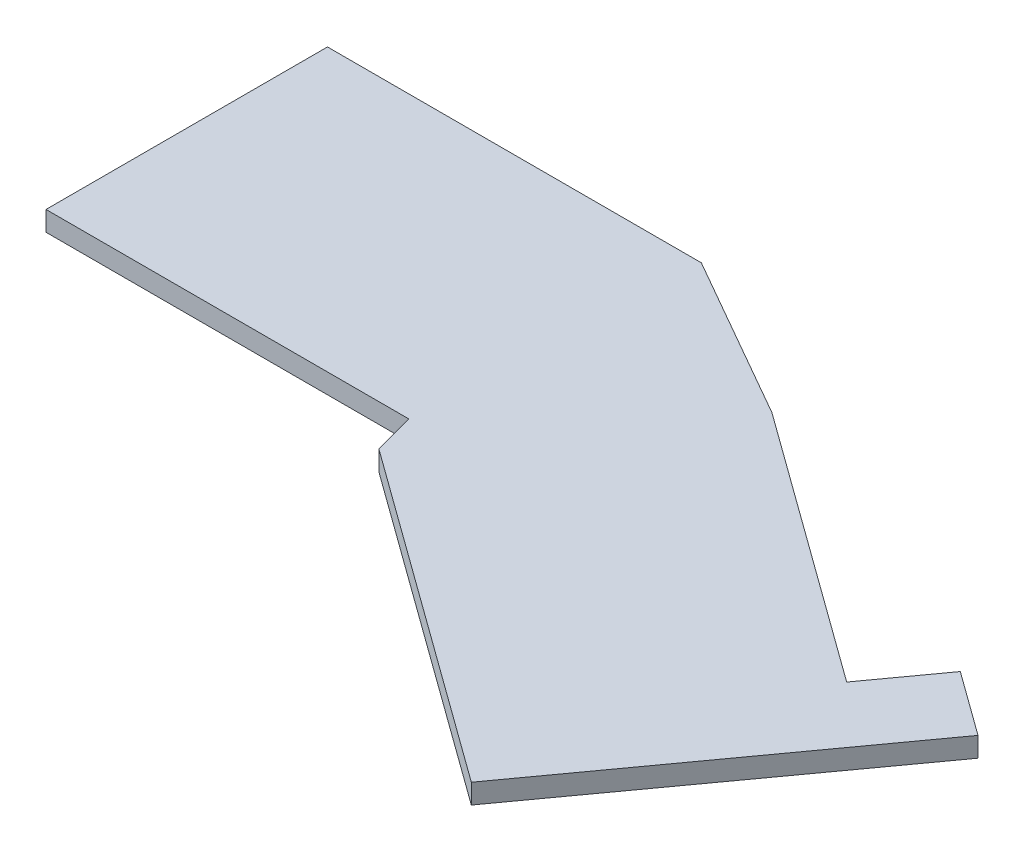
ISO-10303-21;
HEADER;
FILE_DESCRIPTION(('STEP AP214'),'2;1');
FILE_NAME('part.step','',(''),(''),'','','');
FILE_SCHEMA(('AUTOMOTIVE_DESIGN { 1 0 10303 214 1 1 1 1 }'));
ENDSEC;
DATA;
#1=APPLICATION_CONTEXT('core data for automotive mechanical design processes');
#2=APPLICATION_PROTOCOL_DEFINITION('international standard','automotive_design',2000,#1);
#3=PRODUCT_CONTEXT('',#1,'mechanical');
#4=PRODUCT('Part','Part','',(#3));
#5=PRODUCT_RELATED_PRODUCT_CATEGORY('part','',(#4));
#6=PRODUCT_DEFINITION_FORMATION('','',#4);
#7=PRODUCT_DEFINITION_CONTEXT('part definition',#1,'design');
#8=PRODUCT_DEFINITION('design','',#6,#7);
#9=PRODUCT_DEFINITION_SHAPE('','',#8);
#10=(LENGTH_UNIT() NAMED_UNIT(*) SI_UNIT(.MILLI.,.METRE.));
#11=(NAMED_UNIT(*) PLANE_ANGLE_UNIT() SI_UNIT($,.RADIAN.));
#12=(NAMED_UNIT(*) SI_UNIT($,.STERADIAN.) SOLID_ANGLE_UNIT());
#13=UNCERTAINTY_MEASURE_WITH_UNIT(LENGTH_MEASURE(1.E-05),#10,'distance_accuracy_value','');
#14=(GEOMETRIC_REPRESENTATION_CONTEXT(3) GLOBAL_UNCERTAINTY_ASSIGNED_CONTEXT((#13)) GLOBAL_UNIT_ASSIGNED_CONTEXT((#10,
#11,#12)) REPRESENTATION_CONTEXT('',''));
#15=CARTESIAN_POINT('',(0.,0.,0.));
#16=DIRECTION('',(0.,0.,1.));
#17=DIRECTION('',(1.,0.,0.));
#18=AXIS2_PLACEMENT_3D('',#15,#16,#17);
#19=CARTESIAN_POINT('',(83.75,-2.,-32.));
#20=DIRECTION('',(0.,0.,-1.));
#21=DIRECTION('',(-1.,0.,0.));
#22=AXIS2_PLACEMENT_3D('',#19,#20,#21);
#23=PLANE('',#22);
#24=DIRECTION('',(0.,1.,0.));
#25=VECTOR('',#24,1.);
#26=CARTESIAN_POINT('',(-1.25,-2.,-32.));
#27=LINE('',#26,#25);
#28=CARTESIAN_POINT('',(-1.25,-2.,-32.));
#29=VERTEX_POINT('',#28);
#30=CARTESIAN_POINT('',(-1.25,2.5,-32.));
#31=VERTEX_POINT('',#30);
#32=EDGE_CURVE('E42',#29,#31,#27,.T.);
#33=ORIENTED_EDGE('',*,*,#32,.T.);
#34=DIRECTION('',(-1.,0.,0.));
#35=VECTOR('',#34,1.);
#36=CARTESIAN_POINT('',(83.75,2.5,-32.));
#37=LINE('',#36,#35);
#38=CARTESIAN_POINT('',(83.75,2.5,-32.));
#39=VERTEX_POINT('',#38);
#40=EDGE_CURVE('E177',#39,#31,#37,.T.);
#41=ORIENTED_EDGE('',*,*,#40,.F.);
#42=DIRECTION('',(0.,1.,0.));
#43=VECTOR('',#42,1.);
#44=CARTESIAN_POINT('',(83.75,-2.,-32.));
#45=LINE('',#44,#43);
#46=CARTESIAN_POINT('',(83.75,-2.,-32.));
#47=VERTEX_POINT('',#46);
#48=EDGE_CURVE('E11',#47,#39,#45,.T.);
#49=ORIENTED_EDGE('',*,*,#48,.F.);
#50=DIRECTION('',(-1.,0.,0.));
#51=VECTOR('',#50,1.);
#52=CARTESIAN_POINT('',(83.75,-2.,-32.));
#53=LINE('',#52,#51);
#54=EDGE_CURVE('E178',#47,#29,#53,.T.);
#55=ORIENTED_EDGE('',*,*,#54,.T.);
#56=EDGE_LOOP('',(#33,#41,#49,#55));
#57=FACE_BOUND('',#56,.T.);
#58=ADVANCED_FACE('F39',(#57),#23,.T.);
#59=CARTESIAN_POINT('',(121.27783083109,-2.,-10.528824784684));
#60=DIRECTION('',(0.496604406106522,0.,-0.867976994992142));
#61=DIRECTION('',(-0.867976994992142,0.,-0.496604406106522));
#62=AXIS2_PLACEMENT_3D('',#59,#60,#61);
#63=PLANE('',#62);
#64=ORIENTED_EDGE('',*,*,#48,.T.);
#65=DIRECTION('',(-0.867976994992142,0.,-0.496604406106522));
#66=VECTOR('',#65,1.);
#67=CARTESIAN_POINT('',(121.27783083109,2.5,-10.5288247846841));
#68=LINE('',#67,#66);
#69=CARTESIAN_POINT('',(121.27783083109,2.5,-10.5288247846841));
#70=VERTEX_POINT('',#69);
#71=EDGE_CURVE('E198',#70,#39,#68,.T.);
#72=ORIENTED_EDGE('',*,*,#71,.F.);
#73=DIRECTION('',(0.,1.,0.));
#74=VECTOR('',#73,1.);
#75=CARTESIAN_POINT('',(121.27783083109,-2.,-10.528824784684));
#76=LINE('',#75,#74);
#77=CARTESIAN_POINT('',(121.27783083109,-2.,-10.528824784684));
#78=VERTEX_POINT('',#77);
#79=EDGE_CURVE('E48',#78,#70,#76,.T.);
#80=ORIENTED_EDGE('',*,*,#79,.F.);
#81=DIRECTION('',(-0.867976994992142,0.,-0.496604406106522));
#82=VECTOR('',#81,1.);
#83=CARTESIAN_POINT('',(121.27783083109,-2.,-10.528824784684));
#84=LINE('',#83,#82);
#85=EDGE_CURVE('E184',#78,#47,#84,.T.);
#86=ORIENTED_EDGE('',*,*,#85,.T.);
#87=EDGE_LOOP('',(#64,#72,#80,#86));
#88=FACE_BOUND('',#87,.T.);
#89=ADVANCED_FACE('F433',(#88),#63,.T.);
#90=CARTESIAN_POINT('',(182.840995504971,-2.,34.0354743272361));
#91=DIRECTION('',(0.586372356735791,0.,-0.810041640445795));
#92=DIRECTION('',(-0.810041640445795,0.,-0.586372356735791));
#93=AXIS2_PLACEMENT_3D('',#90,#91,#92);
#94=PLANE('',#93);
#95=ORIENTED_EDGE('',*,*,#79,.T.);
#96=DIRECTION('',(-0.810041640445795,0.,-0.586372356735791));
#97=VECTOR('',#96,1.);
#98=CARTESIAN_POINT('',(182.840995504971,2.5,34.0354743272362));
#99=LINE('',#98,#97);
#100=CARTESIAN_POINT('',(182.840995504971,2.5,34.0354743272362));
#101=VERTEX_POINT('',#100);
#102=EDGE_CURVE('E224',#101,#70,#99,.T.);
#103=ORIENTED_EDGE('',*,*,#102,.F.);
#104=DIRECTION('',(0.,1.,0.));
#105=VECTOR('',#104,1.);
#106=CARTESIAN_POINT('',(182.840995504971,-2.,34.0354743272361));
#107=LINE('',#106,#105);
#108=CARTESIAN_POINT('',(182.840995504971,-2.,34.0354743272361));
#109=VERTEX_POINT('',#108);
#110=EDGE_CURVE('E384',#109,#101,#107,.T.);
#111=ORIENTED_EDGE('',*,*,#110,.F.);
#112=DIRECTION('',(-0.810041640445795,0.,-0.586372356735791));
#113=VECTOR('',#112,1.);
#114=CARTESIAN_POINT('',(182.840995504971,-2.,34.0354743272361));
#115=LINE('',#114,#113);
#116=EDGE_CURVE('E375',#109,#78,#115,.T.);
#117=ORIENTED_EDGE('',*,*,#116,.T.);
#118=EDGE_LOOP('',(#95,#103,#111,#117));
#119=FACE_BOUND('',#118,.T.);
#120=ADVANCED_FACE('F430',(#119),#94,.T.);
#121=CARTESIAN_POINT('',(193.688884104583,-2.,19.0497039789889));
#122=DIRECTION('',(-0.810041640445795,0.,-0.586372356735791));
#123=DIRECTION('',(-0.586372356735791,0.,0.810041640445795));
#124=AXIS2_PLACEMENT_3D('',#121,#122,#123);
#125=PLANE('',#124);
#126=ORIENTED_EDGE('',*,*,#110,.T.);
#127=DIRECTION('',(-0.586372356735791,0.,0.810041640445795));
#128=VECTOR('',#127,1.);
#129=CARTESIAN_POINT('',(193.688884104583,2.5,19.0497039789889));
#130=LINE('',#129,#128);
#131=CARTESIAN_POINT('',(193.688884104583,2.5,19.0497039789889));
#132=VERTEX_POINT('',#131);
#133=EDGE_CURVE('E220',#132,#101,#130,.T.);
#134=ORIENTED_EDGE('',*,*,#133,.F.);
#135=DIRECTION('',(0.,1.,0.));
#136=VECTOR('',#135,1.);
#137=CARTESIAN_POINT('',(193.688884104583,-2.,19.0497039789889));
#138=LINE('',#137,#136);
#139=CARTESIAN_POINT('',(193.688884104583,-2.,19.0497039789889));
#140=VERTEX_POINT('',#139);
#141=EDGE_CURVE('E387',#140,#132,#138,.T.);
#142=ORIENTED_EDGE('',*,*,#141,.F.);
#143=DIRECTION('',(-0.586372356735791,0.,0.810041640445795));
#144=VECTOR('',#143,1.);
#145=CARTESIAN_POINT('',(193.688884104583,-2.,19.0497039789889));
#146=LINE('',#145,#144);
#147=EDGE_CURVE('E371',#140,#109,#146,.T.);
#148=ORIENTED_EDGE('',*,*,#147,.T.);
#149=EDGE_LOOP('',(#126,#134,#142,#148));
#150=FACE_BOUND('',#149,.T.);
#151=ADVANCED_FACE('F426',(#150),#125,.T.);
#152=CARTESIAN_POINT('',(208.269633632608,-2.,29.6044064002333));
#153=DIRECTION('',(0.58637235673579,0.,-0.810041640445795));
#154=DIRECTION('',(-0.810041640445795,0.,-0.58637235673579));
#155=AXIS2_PLACEMENT_3D('',#152,#153,#154);
#156=PLANE('',#155);
#157=ORIENTED_EDGE('',*,*,#141,.T.);
#158=DIRECTION('',(-0.810041640445795,0.,-0.586372356735791));
#159=VECTOR('',#158,1.);
#160=CARTESIAN_POINT('',(208.269633632608,2.5,29.6044064002333));
#161=LINE('',#160,#159);
#162=CARTESIAN_POINT('',(208.269633632608,2.5,29.6044064002333));
#163=VERTEX_POINT('',#162);
#164=EDGE_CURVE('E216',#163,#132,#161,.T.);
#165=ORIENTED_EDGE('',*,*,#164,.F.);
#166=DIRECTION('',(0.,1.,0.));
#167=VECTOR('',#166,1.);
#168=CARTESIAN_POINT('',(208.269633632608,-2.,29.6044064002333));
#169=LINE('',#168,#167);
#170=CARTESIAN_POINT('',(208.269633632608,-2.,29.6044064002333));
#171=VERTEX_POINT('',#170);
#172=EDGE_CURVE('E390',#171,#163,#169,.T.);
#173=ORIENTED_EDGE('',*,*,#172,.F.);
#174=DIRECTION('',(-0.810041640445795,0.,-0.58637235673579));
#175=VECTOR('',#174,1.);
#176=CARTESIAN_POINT('',(208.269633632608,-2.,29.6044064002333));
#177=LINE('',#176,#175);
#178=EDGE_CURVE('E367',#171,#140,#177,.T.);
#179=ORIENTED_EDGE('',*,*,#178,.T.);
#180=EDGE_LOOP('',(#157,#165,#173,#179));
#181=FACE_BOUND('',#180,.T.);
#182=ADVANCED_FACE('F424',(#181),#156,.T.);
#183=CARTESIAN_POINT('',(159.893914201905,-2.,96.4328417370113));
#184=DIRECTION('',(0.810041640445794,0.,0.586372356735792));
#185=DIRECTION('',(0.586372356735792,0.,-0.810041640445794));
#186=AXIS2_PLACEMENT_3D('',#183,#184,#185);
#187=PLANE('',#186);
#188=ORIENTED_EDGE('',*,*,#172,.T.);
#189=DIRECTION('',(0.586372356735791,0.,-0.810041640445794));
#190=VECTOR('',#189,1.);
#191=CARTESIAN_POINT('',(159.893914201905,2.5,96.4328417370113));
#192=LINE('',#191,#190);
#193=CARTESIAN_POINT('',(159.893914201905,2.5,96.4328417370113));
#194=VERTEX_POINT('',#193);
#195=EDGE_CURVE('E212',#194,#163,#192,.T.);
#196=ORIENTED_EDGE('',*,*,#195,.F.);
#197=DIRECTION('',(0.,1.,0.));
#198=VECTOR('',#197,1.);
#199=CARTESIAN_POINT('',(159.893914201905,-2.,96.4328417370113));
#200=LINE('',#199,#198);
#201=CARTESIAN_POINT('',(159.893914201905,-2.,96.4328417370113));
#202=VERTEX_POINT('',#201);
#203=EDGE_CURVE('E393',#202,#194,#200,.T.);
#204=ORIENTED_EDGE('',*,*,#203,.F.);
#205=DIRECTION('',(0.586372356735792,0.,-0.810041640445794));
#206=VECTOR('',#205,1.);
#207=CARTESIAN_POINT('',(159.893914201905,-2.,96.4328417370113));
#208=LINE('',#207,#206);
#209=EDGE_CURVE('E363',#202,#171,#208,.T.);
#210=ORIENTED_EDGE('',*,*,#209,.T.);
#211=EDGE_LOOP('',(#188,#196,#204,#210));
#212=FACE_BOUND('',#211,.T.);
#213=ADVANCED_FACE('F419',(#212),#187,.T.);
#214=CARTESIAN_POINT('',(83.75,-2.,41.3138402038469));
#215=DIRECTION('',(-0.586372356735791,0.,0.810041640445795));
#216=DIRECTION('',(0.810041640445795,0.,0.586372356735791));
#217=AXIS2_PLACEMENT_3D('',#214,#215,#216);
#218=PLANE('',#217);
#219=ORIENTED_EDGE('',*,*,#203,.T.);
#220=DIRECTION('',(0.810041640445795,0.,0.586372356735791));
#221=VECTOR('',#220,1.);
#222=CARTESIAN_POINT('',(83.75,2.5,41.3138402038469));
#223=LINE('',#222,#221);
#224=CARTESIAN_POINT('',(83.75,2.5,41.3138402038469));
#225=VERTEX_POINT('',#224);
#226=EDGE_CURVE('E208',#225,#194,#223,.T.);
#227=ORIENTED_EDGE('',*,*,#226,.F.);
#228=DIRECTION('',(0.,1.,0.));
#229=VECTOR('',#228,1.);
#230=CARTESIAN_POINT('',(83.75,-2.,41.3138402038469));
#231=LINE('',#230,#229);
#232=CARTESIAN_POINT('',(83.75,-2.,41.3138402038469));
#233=VERTEX_POINT('',#232);
#234=EDGE_CURVE('E396',#233,#225,#231,.T.);
#235=ORIENTED_EDGE('',*,*,#234,.F.);
#236=DIRECTION('',(0.810041640445795,0.,0.586372356735791));
#237=VECTOR('',#236,1.);
#238=CARTESIAN_POINT('',(83.75,-2.,41.3138402038469));
#239=LINE('',#238,#237);
#240=EDGE_CURVE('E359',#233,#202,#239,.T.);
#241=ORIENTED_EDGE('',*,*,#240,.T.);
#242=EDGE_LOOP('',(#219,#227,#235,#241));
#243=FACE_BOUND('',#242,.T.);
#244=ADVANCED_FACE('F412',(#243),#218,.T.);
#245=CARTESIAN_POINT('',(81.25,-2.,32.));
#246=DIRECTION('',(-0.965812600121666,0.,0.259241241792712));
#247=DIRECTION('',(0.259241241792712,0.,0.965812600121666));
#248=AXIS2_PLACEMENT_3D('',#245,#246,#247);
#249=PLANE('',#248);
#250=ORIENTED_EDGE('',*,*,#234,.T.);
#251=DIRECTION('',(0.259241241792712,0.,0.965812600121666));
#252=VECTOR('',#251,1.);
#253=CARTESIAN_POINT('',(81.25,2.5,32.));
#254=LINE('',#253,#252);
#255=CARTESIAN_POINT('',(81.25,2.5,32.));
#256=VERTEX_POINT('',#255);
#257=EDGE_CURVE('E204',#256,#225,#254,.T.);
#258=ORIENTED_EDGE('',*,*,#257,.F.);
#259=DIRECTION('',(0.,1.,0.));
#260=VECTOR('',#259,1.);
#261=CARTESIAN_POINT('',(81.25,-2.,32.));
#262=LINE('',#261,#260);
#263=CARTESIAN_POINT('',(81.25,-2.,32.));
#264=VERTEX_POINT('',#263);
#265=EDGE_CURVE('E399',#264,#256,#262,.T.);
#266=ORIENTED_EDGE('',*,*,#265,.F.);
#267=DIRECTION('',(0.259241241792712,0.,0.965812600121666));
#268=VECTOR('',#267,1.);
#269=CARTESIAN_POINT('',(81.25,-2.,32.));
#270=LINE('',#269,#268);
#271=EDGE_CURVE('E355',#264,#233,#270,.T.);
#272=ORIENTED_EDGE('',*,*,#271,.T.);
#273=EDGE_LOOP('',(#250,#258,#266,#272));
#274=FACE_BOUND('',#273,.T.);
#275=ADVANCED_FACE('F409',(#274),#249,.T.);
#276=CARTESIAN_POINT('',(-1.25,-2.,32.));
#277=DIRECTION('',(0.,0.,1.));
#278=DIRECTION('',(1.,0.,0.));
#279=AXIS2_PLACEMENT_3D('',#276,#277,#278);
#280=PLANE('',#279);
#281=ORIENTED_EDGE('',*,*,#265,.T.);
#282=DIRECTION('',(1.,0.,0.));
#283=VECTOR('',#282,1.);
#284=CARTESIAN_POINT('',(-1.25,2.5,32.));
#285=LINE('',#284,#283);
#286=CARTESIAN_POINT('',(-1.25,2.5,32.));
#287=VERTEX_POINT('',#286);
#288=EDGE_CURVE('E192',#287,#256,#285,.T.);
#289=ORIENTED_EDGE('',*,*,#288,.F.);
#290=DIRECTION('',(0.,1.,0.));
#291=VECTOR('',#290,1.);
#292=CARTESIAN_POINT('',(-1.25,-2.,32.));
#293=LINE('',#292,#291);
#294=CARTESIAN_POINT('',(-1.25,-2.,32.));
#295=VERTEX_POINT('',#294);
#296=EDGE_CURVE('E183',#295,#287,#293,.T.);
#297=ORIENTED_EDGE('',*,*,#296,.F.);
#298=DIRECTION('',(1.,0.,0.));
#299=VECTOR('',#298,1.);
#300=CARTESIAN_POINT('',(-1.25,-2.,32.));
#301=LINE('',#300,#299);
#302=EDGE_CURVE('E351',#295,#264,#301,.T.);
#303=ORIENTED_EDGE('',*,*,#302,.T.);
#304=EDGE_LOOP('',(#281,#289,#297,#303));
#305=FACE_BOUND('',#304,.T.);
#306=ADVANCED_FACE('F403',(#305),#280,.T.);
#307=CARTESIAN_POINT('',(-1.25,-2.,-32.));
#308=DIRECTION('',(-1.,0.,0.));
#309=DIRECTION('',(0.,0.,1.));
#310=AXIS2_PLACEMENT_3D('',#307,#308,#309);
#311=PLANE('',#310);
#312=ORIENTED_EDGE('',*,*,#296,.T.);
#313=DIRECTION('',(0.,0.,1.));
#314=VECTOR('',#313,1.);
#315=CARTESIAN_POINT('',(-1.25,2.5,-32.));
#316=LINE('',#315,#314);
#317=EDGE_CURVE('E186',#31,#287,#316,.T.);
#318=ORIENTED_EDGE('',*,*,#317,.F.);
#319=ORIENTED_EDGE('',*,*,#32,.F.);
#320=DIRECTION('',(0.,0.,1.));
#321=VECTOR('',#320,1.);
#322=CARTESIAN_POINT('',(-1.25,-2.,-32.));
#323=LINE('',#322,#321);
#324=EDGE_CURVE('E348',#29,#295,#323,.T.);
#325=ORIENTED_EDGE('',*,*,#324,.T.);
#326=EDGE_LOOP('',(#312,#318,#319,#325));
#327=FACE_BOUND('',#326,.T.);
#328=ADVANCED_FACE('F187',(#327),#311,.T.);
#329=CARTESIAN_POINT('',(0.,-2.,0.));
#330=DIRECTION('',(0.,1.,0.));
#331=DIRECTION('',(0.,0.,1.));
#332=AXIS2_PLACEMENT_3D('',#329,#330,#331);
#333=PLANE('',#332);
#334=DIRECTION('',(-0.867976994992141,0.,-0.496604406106522));
#335=VECTOR('',#334,1.);
#336=CARTESIAN_POINT('',(120.59903327137,-2.,-9.47706172384793));
#337=LINE('',#336,#335);
#338=CARTESIAN_POINT('',(120.59903327137,-2.,-9.47706172384793));
#339=VERTEX_POINT('',#338);
#340=CARTESIAN_POINT('',(83.4176856785189,-2.,-30.75));
#341=VERTEX_POINT('',#340);
#342=EDGE_CURVE('E265',#339,#341,#337,.T.);
#343=ORIENTED_EDGE('',*,*,#342,.T.);
#344=DIRECTION('',(-1.,0.,0.));
#345=VECTOR('',#344,1.);
#346=CARTESIAN_POINT('',(83.4176856785189,-2.,-30.75));
#347=LINE('',#346,#345);
#348=CARTESIAN_POINT('',(0.,-2.,-30.75));
#349=VERTEX_POINT('',#348);
#350=EDGE_CURVE('E230',#341,#349,#347,.T.);
#351=ORIENTED_EDGE('',*,*,#350,.T.);
#352=DIRECTION('',(0.,0.,1.));
#353=VECTOR('',#352,1.);
#354=CARTESIAN_POINT('',(0.,-2.,-30.75));
#355=LINE('',#354,#353);
#356=CARTESIAN_POINT('',(0.,-2.,30.75));
#357=VERTEX_POINT('',#356);
#358=EDGE_CURVE('E234',#349,#357,#355,.T.);
#359=ORIENTED_EDGE('',*,*,#358,.T.);
#360=DIRECTION('',(1.,0.,0.));
#361=VECTOR('',#360,1.);
#362=CARTESIAN_POINT('',(0.,-2.,30.75));
#363=LINE('',#362,#361);
#364=CARTESIAN_POINT('',(82.2087247543079,-2.,30.75));
#365=VERTEX_POINT('',#364);
#366=EDGE_CURVE('E56',#357,#365,#363,.T.);
#367=ORIENTED_EDGE('',*,*,#366,.T.);
#368=DIRECTION('',(0.259241241792712,0.,0.965812600121666));
#369=VECTOR('',#368,1.);
#370=CARTESIAN_POINT('',(82.2087247543079,-2.,30.75));
#371=LINE('',#370,#369);
#372=CARTESIAN_POINT('',(84.8422744771276,-2.,40.5613845148914));
#373=VERTEX_POINT('',#372);
#374=EDGE_CURVE('E241',#365,#373,#371,.T.);
#375=ORIENTED_EDGE('',*,*,#374,.T.);
#376=DIRECTION('',(0.810041640445795,0.,0.586372356735791));
#377=VECTOR('',#376,1.);
#378=CARTESIAN_POINT('',(84.8422744771276,-2.,40.5613845148914));
#379=LINE('',#378,#377);
#380=CARTESIAN_POINT('',(159.614327597267,-2.,94.6873242405344));
#381=VERTEX_POINT('',#380);
#382=EDGE_CURVE('E245',#373,#381,#379,.T.);
#383=ORIENTED_EDGE('',*,*,#382,.T.);
#384=DIRECTION('',(0.586372356735791,0.,-0.810041640445794));
#385=VECTOR('',#384,1.);
#386=CARTESIAN_POINT('',(159.614327597267,-2.,94.6873242405344));
#387=LINE('',#386,#385);
#388=CARTESIAN_POINT('',(206.524116136131,-2.,29.8839930048708));
#389=VERTEX_POINT('',#388);
#390=EDGE_CURVE('E249',#381,#389,#387,.T.);
#391=ORIENTED_EDGE('',*,*,#390,.T.);
#392=DIRECTION('',(-0.810041640445795,0.,-0.58637235673579));
#393=VECTOR('',#392,1.);
#394=CARTESIAN_POINT('',(206.524116136131,-2.,29.8839930048708));
#395=LINE('',#394,#393);
#396=CARTESIAN_POINT('',(193.968470709221,-2.,20.7952214754659));
#397=VERTEX_POINT('',#396);
#398=EDGE_CURVE('E253',#389,#397,#395,.T.);
#399=ORIENTED_EDGE('',*,*,#398,.T.);
#400=DIRECTION('',(-0.586372356735791,0.,0.810041640445795));
#401=VECTOR('',#400,1.);
#402=CARTESIAN_POINT('',(193.968470709221,-2.,20.7952214754659));
#403=LINE('',#402,#401);
#404=CARTESIAN_POINT('',(183.120582109609,-2.,35.7809918237131));
#405=VERTEX_POINT('',#404);
#406=EDGE_CURVE('E257',#397,#405,#403,.T.);
#407=ORIENTED_EDGE('',*,*,#406,.T.);
#408=DIRECTION('',(-0.810041640445795,0.,-0.586372356735791));
#409=VECTOR('',#408,1.);
#410=CARTESIAN_POINT('',(183.120582109609,-2.,35.7809918237131));
#411=LINE('',#410,#409);
#412=EDGE_CURVE('E261',#405,#339,#411,.T.);
#413=ORIENTED_EDGE('',*,*,#412,.T.);
#414=EDGE_LOOP('',(#343,#351,#359,#367,#375,#383,#391,#399,#407,#413));
#415=FACE_BOUND('',#414,.T.);
#416=ORIENTED_EDGE('',*,*,#54,.F.);
#417=ORIENTED_EDGE('',*,*,#85,.F.);
#418=ORIENTED_EDGE('',*,*,#116,.F.);
#419=ORIENTED_EDGE('',*,*,#147,.F.);
#420=ORIENTED_EDGE('',*,*,#178,.F.);
#421=ORIENTED_EDGE('',*,*,#209,.F.);
#422=ORIENTED_EDGE('',*,*,#240,.F.);
#423=ORIENTED_EDGE('',*,*,#271,.F.);
#424=ORIENTED_EDGE('',*,*,#302,.F.);
#425=ORIENTED_EDGE('',*,*,#324,.F.);
#426=EDGE_LOOP('',(#416,#417,#418,#419,#420,#421,#422,#423,#424,#425));
#427=FACE_BOUND('',#426,.T.);
#428=ADVANCED_FACE('F415',(#415,#427),#333,.F.);
#429=CARTESIAN_POINT('',(83.4176856785189,-2.,-30.75));
#430=DIRECTION('',(0.,0.,-1.));
#431=DIRECTION('',(-1.,0.,0.));
#432=AXIS2_PLACEMENT_3D('',#429,#430,#431);
#433=PLANE('',#432);
#434=DIRECTION('',(-1.,0.,0.));
#435=VECTOR('',#434,1.);
#436=CARTESIAN_POINT('',(83.4176856785189,0.,-30.75));
#437=LINE('',#436,#435);
#438=CARTESIAN_POINT('',(83.4176856785189,0.,-30.75));
#439=VERTEX_POINT('',#438);
#440=CARTESIAN_POINT('',(0.,0.,-30.75));
#441=VERTEX_POINT('',#440);
#442=EDGE_CURVE('E229',#439,#441,#437,.T.);
#443=ORIENTED_EDGE('',*,*,#442,.T.);
#444=DIRECTION('',(0.,1.,0.));
#445=VECTOR('',#444,1.);
#446=CARTESIAN_POINT('',(0.,-2.,-30.75));
#447=LINE('',#446,#445);
#448=EDGE_CURVE('E269',#349,#441,#447,.T.);
#449=ORIENTED_EDGE('',*,*,#448,.F.);
#450=ORIENTED_EDGE('',*,*,#350,.F.);
#451=DIRECTION('',(0.,1.,0.));
#452=VECTOR('',#451,1.);
#453=CARTESIAN_POINT('',(83.4176856785189,-2.,-30.75));
#454=LINE('',#453,#452);
#455=EDGE_CURVE('E308',#341,#439,#454,.T.);
#456=ORIENTED_EDGE('',*,*,#455,.T.);
#457=EDGE_LOOP('',(#443,#449,#450,#456));
#458=FACE_BOUND('',#457,.T.);
#459=ADVANCED_FACE('F459',(#458),#433,.F.);
#460=CARTESIAN_POINT('',(120.59903327137,-2.,-9.47706172384793));
#461=DIRECTION('',(0.496604406106522,0.,-0.867976994992142));
#462=DIRECTION('',(-0.867976994992142,0.,-0.496604406106522));
#463=AXIS2_PLACEMENT_3D('',#460,#461,#462);
#464=PLANE('',#463);
#465=DIRECTION('',(-0.867976994992141,0.,-0.496604406106522));
#466=VECTOR('',#465,1.);
#467=CARTESIAN_POINT('',(120.59903327137,0.,-9.47706172384793));
#468=LINE('',#467,#466);
#469=CARTESIAN_POINT('',(120.59903327137,0.,-9.47706172384793));
#470=VERTEX_POINT('',#469);
#471=EDGE_CURVE('E235',#470,#439,#468,.T.);
#472=ORIENTED_EDGE('',*,*,#471,.T.);
#473=ORIENTED_EDGE('',*,*,#455,.F.);
#474=ORIENTED_EDGE('',*,*,#342,.F.);
#475=DIRECTION('',(0.,1.,0.));
#476=VECTOR('',#475,1.);
#477=CARTESIAN_POINT('',(120.59903327137,-2.,-9.47706172384793));
#478=LINE('',#477,#476);
#479=EDGE_CURVE('E312',#339,#470,#478,.T.);
#480=ORIENTED_EDGE('',*,*,#479,.T.);
#481=EDGE_LOOP('',(#472,#473,#474,#480));
#482=FACE_BOUND('',#481,.T.);
#483=ADVANCED_FACE('F464',(#482),#464,.F.);
#484=CARTESIAN_POINT('',(183.120582109609,-2.,35.7809918237131));
#485=DIRECTION('',(0.586372356735791,0.,-0.810041640445795));
#486=DIRECTION('',(-0.810041640445795,0.,-0.586372356735791));
#487=AXIS2_PLACEMENT_3D('',#484,#485,#486);
#488=PLANE('',#487);
#489=DIRECTION('',(-0.810041640445795,0.,-0.586372356735791));
#490=VECTOR('',#489,1.);
#491=CARTESIAN_POINT('',(183.120582109609,0.,35.7809918237131));
#492=LINE('',#491,#490);
#493=CARTESIAN_POINT('',(183.120582109609,0.,35.7809918237131));
#494=VERTEX_POINT('',#493);
#495=EDGE_CURVE('E301',#494,#470,#492,.T.);
#496=ORIENTED_EDGE('',*,*,#495,.T.);
#497=ORIENTED_EDGE('',*,*,#479,.F.);
#498=ORIENTED_EDGE('',*,*,#412,.F.);
#499=DIRECTION('',(0.,1.,0.));
#500=VECTOR('',#499,1.);
#501=CARTESIAN_POINT('',(183.120582109609,-2.,35.7809918237131));
#502=LINE('',#501,#500);
#503=EDGE_CURVE('E316',#405,#494,#502,.T.);
#504=ORIENTED_EDGE('',*,*,#503,.T.);
#505=EDGE_LOOP('',(#496,#497,#498,#504));
#506=FACE_BOUND('',#505,.T.);
#507=ADVANCED_FACE('F489',(#506),#488,.F.);
#508=CARTESIAN_POINT('',(193.968470709221,-2.,20.7952214754659));
#509=DIRECTION('',(-0.810041640445795,0.,-0.586372356735791));
#510=DIRECTION('',(-0.586372356735791,0.,0.810041640445795));
#511=AXIS2_PLACEMENT_3D('',#508,#509,#510);
#512=PLANE('',#511);
#513=DIRECTION('',(-0.586372356735791,0.,0.810041640445795));
#514=VECTOR('',#513,1.);
#515=CARTESIAN_POINT('',(193.968470709221,0.,20.7952214754659));
#516=LINE('',#515,#514);
#517=CARTESIAN_POINT('',(193.968470709221,0.,20.7952214754659));
#518=VERTEX_POINT('',#517);
#519=EDGE_CURVE('E297',#518,#494,#516,.T.);
#520=ORIENTED_EDGE('',*,*,#519,.T.);
#521=ORIENTED_EDGE('',*,*,#503,.F.);
#522=ORIENTED_EDGE('',*,*,#406,.F.);
#523=DIRECTION('',(0.,1.,0.));
#524=VECTOR('',#523,1.);
#525=CARTESIAN_POINT('',(193.968470709221,-2.,20.7952214754659));
#526=LINE('',#525,#524);
#527=EDGE_CURVE('E320',#397,#518,#526,.T.);
#528=ORIENTED_EDGE('',*,*,#527,.T.);
#529=EDGE_LOOP('',(#520,#521,#522,#528));
#530=FACE_BOUND('',#529,.T.);
#531=ADVANCED_FACE('F487',(#530),#512,.F.);
#532=CARTESIAN_POINT('',(206.524116136131,-2.,29.8839930048708));
#533=DIRECTION('',(0.58637235673579,0.,-0.810041640445795));
#534=DIRECTION('',(-0.810041640445795,0.,-0.586372356735791));
#535=AXIS2_PLACEMENT_3D('',#532,#533,#534);
#536=PLANE('',#535);
#537=DIRECTION('',(-0.810041640445795,0.,-0.58637235673579));
#538=VECTOR('',#537,1.);
#539=CARTESIAN_POINT('',(206.524116136131,0.,29.8839930048708));
#540=LINE('',#539,#538);
#541=CARTESIAN_POINT('',(206.524116136131,0.,29.8839930048708));
#542=VERTEX_POINT('',#541);
#543=EDGE_CURVE('E293',#542,#518,#540,.T.);
#544=ORIENTED_EDGE('',*,*,#543,.T.);
#545=ORIENTED_EDGE('',*,*,#527,.F.);
#546=ORIENTED_EDGE('',*,*,#398,.F.);
#547=DIRECTION('',(0.,1.,0.));
#548=VECTOR('',#547,1.);
#549=CARTESIAN_POINT('',(206.524116136131,-2.,29.8839930048708));
#550=LINE('',#549,#548);
#551=EDGE_CURVE('E324',#389,#542,#550,.T.);
#552=ORIENTED_EDGE('',*,*,#551,.T.);
#553=EDGE_LOOP('',(#544,#545,#546,#552));
#554=FACE_BOUND('',#553,.T.);
#555=ADVANCED_FACE('F485',(#554),#536,.F.);
#556=CARTESIAN_POINT('',(159.614327597267,-2.,94.6873242405344));
#557=DIRECTION('',(0.810041640445795,0.,0.586372356735792));
#558=DIRECTION('',(0.586372356735792,0.,-0.810041640445795));
#559=AXIS2_PLACEMENT_3D('',#556,#557,#558);
#560=PLANE('',#559);
#561=DIRECTION('',(0.586372356735791,0.,-0.810041640445794));
#562=VECTOR('',#561,1.);
#563=CARTESIAN_POINT('',(159.614327597267,0.,94.6873242405344));
#564=LINE('',#563,#562);
#565=CARTESIAN_POINT('',(159.614327597267,0.,94.6873242405344));
#566=VERTEX_POINT('',#565);
#567=EDGE_CURVE('E289',#566,#542,#564,.T.);
#568=ORIENTED_EDGE('',*,*,#567,.T.);
#569=ORIENTED_EDGE('',*,*,#551,.F.);
#570=ORIENTED_EDGE('',*,*,#390,.F.);
#571=DIRECTION('',(0.,1.,0.));
#572=VECTOR('',#571,1.);
#573=CARTESIAN_POINT('',(159.614327597267,-2.,94.6873242405344));
#574=LINE('',#573,#572);
#575=EDGE_CURVE('E328',#381,#566,#574,.T.);
#576=ORIENTED_EDGE('',*,*,#575,.T.);
#577=EDGE_LOOP('',(#568,#569,#570,#576));
#578=FACE_BOUND('',#577,.T.);
#579=ADVANCED_FACE('F481',(#578),#560,.F.);
#580=CARTESIAN_POINT('',(84.8422744771276,-2.,40.5613845148914));
#581=DIRECTION('',(-0.586372356735791,0.,0.810041640445795));
#582=DIRECTION('',(0.810041640445795,0.,0.586372356735791));
#583=AXIS2_PLACEMENT_3D('',#580,#581,#582);
#584=PLANE('',#583);
#585=DIRECTION('',(0.810041640445795,0.,0.586372356735791));
#586=VECTOR('',#585,1.);
#587=CARTESIAN_POINT('',(84.8422744771276,0.,40.5613845148914));
#588=LINE('',#587,#586);
#589=CARTESIAN_POINT('',(84.8422744771276,0.,40.5613845148914));
#590=VERTEX_POINT('',#589);
#591=EDGE_CURVE('E285',#590,#566,#588,.T.);
#592=ORIENTED_EDGE('',*,*,#591,.T.);
#593=ORIENTED_EDGE('',*,*,#575,.F.);
#594=ORIENTED_EDGE('',*,*,#382,.F.);
#595=DIRECTION('',(0.,1.,0.));
#596=VECTOR('',#595,1.);
#597=CARTESIAN_POINT('',(84.8422744771276,-2.,40.5613845148914));
#598=LINE('',#597,#596);
#599=EDGE_CURVE('E332',#373,#590,#598,.T.);
#600=ORIENTED_EDGE('',*,*,#599,.T.);
#601=EDGE_LOOP('',(#592,#593,#594,#600));
#602=FACE_BOUND('',#601,.T.);
#603=ADVANCED_FACE('F478',(#602),#584,.F.);
#604=CARTESIAN_POINT('',(82.2087247543079,-2.,30.75));
#605=DIRECTION('',(-0.965812600121666,0.,0.259241241792712));
#606=DIRECTION('',(0.259241241792712,0.,0.965812600121666));
#607=AXIS2_PLACEMENT_3D('',#604,#605,#606);
#608=PLANE('',#607);
#609=DIRECTION('',(0.259241241792712,0.,0.965812600121666));
#610=VECTOR('',#609,1.);
#611=CARTESIAN_POINT('',(82.2087247543079,0.,30.75));
#612=LINE('',#611,#610);
#613=CARTESIAN_POINT('',(82.2087247543079,0.,30.75));
#614=VERTEX_POINT('',#613);
#615=EDGE_CURVE('E281',#614,#590,#612,.T.);
#616=ORIENTED_EDGE('',*,*,#615,.T.);
#617=ORIENTED_EDGE('',*,*,#599,.F.);
#618=ORIENTED_EDGE('',*,*,#374,.F.);
#619=DIRECTION('',(0.,1.,0.));
#620=VECTOR('',#619,1.);
#621=CARTESIAN_POINT('',(82.2087247543079,-2.,30.75));
#622=LINE('',#621,#620);
#623=EDGE_CURVE('E336',#365,#614,#622,.T.);
#624=ORIENTED_EDGE('',*,*,#623,.T.);
#625=EDGE_LOOP('',(#616,#617,#618,#624));
#626=FACE_BOUND('',#625,.T.);
#627=ADVANCED_FACE('F476',(#626),#608,.F.);
#628=CARTESIAN_POINT('',(0.,-2.,30.75));
#629=DIRECTION('',(0.,0.,1.));
#630=DIRECTION('',(1.,0.,0.));
#631=AXIS2_PLACEMENT_3D('',#628,#629,#630);
#632=PLANE('',#631);
#633=DIRECTION('',(1.,0.,0.));
#634=VECTOR('',#633,1.);
#635=CARTESIAN_POINT('',(0.,0.,30.75));
#636=LINE('',#635,#634);
#637=CARTESIAN_POINT('',(0.,0.,30.75));
#638=VERTEX_POINT('',#637);
#639=EDGE_CURVE('E277',#638,#614,#636,.T.);
#640=ORIENTED_EDGE('',*,*,#639,.T.);
#641=ORIENTED_EDGE('',*,*,#623,.F.);
#642=ORIENTED_EDGE('',*,*,#366,.F.);
#643=DIRECTION('',(0.,1.,0.));
#644=VECTOR('',#643,1.);
#645=CARTESIAN_POINT('',(0.,-2.,30.75));
#646=LINE('',#645,#644);
#647=EDGE_CURVE('E340',#357,#638,#646,.T.);
#648=ORIENTED_EDGE('',*,*,#647,.T.);
#649=EDGE_LOOP('',(#640,#641,#642,#648));
#650=FACE_BOUND('',#649,.T.);
#651=ADVANCED_FACE('F492',(#650),#632,.F.);
#652=CARTESIAN_POINT('',(0.,-2.,-30.75));
#653=DIRECTION('',(-1.,0.,0.));
#654=DIRECTION('',(0.,0.,1.));
#655=AXIS2_PLACEMENT_3D('',#652,#653,#654);
#656=PLANE('',#655);
#657=DIRECTION('',(0.,0.,1.));
#658=VECTOR('',#657,1.);
#659=CARTESIAN_POINT('',(0.,0.,-30.75));
#660=LINE('',#659,#658);
#661=EDGE_CURVE('E273',#441,#638,#660,.T.);
#662=ORIENTED_EDGE('',*,*,#661,.T.);
#663=ORIENTED_EDGE('',*,*,#647,.F.);
#664=ORIENTED_EDGE('',*,*,#358,.F.);
#665=ORIENTED_EDGE('',*,*,#448,.T.);
#666=EDGE_LOOP('',(#662,#663,#664,#665));
#667=FACE_BOUND('',#666,.T.);
#668=ADVANCED_FACE('F472',(#667),#656,.F.);
#669=CARTESIAN_POINT('',(0.,0.,0.));
#670=DIRECTION('',(0.,1.,0.));
#671=DIRECTION('',(0.,0.,1.));
#672=AXIS2_PLACEMENT_3D('',#669,#670,#671);
#673=PLANE('',#672);
#674=ORIENTED_EDGE('',*,*,#442,.F.);
#675=ORIENTED_EDGE('',*,*,#471,.F.);
#676=ORIENTED_EDGE('',*,*,#495,.F.);
#677=ORIENTED_EDGE('',*,*,#519,.F.);
#678=ORIENTED_EDGE('',*,*,#543,.F.);
#679=ORIENTED_EDGE('',*,*,#567,.F.);
#680=ORIENTED_EDGE('',*,*,#591,.F.);
#681=ORIENTED_EDGE('',*,*,#615,.F.);
#682=ORIENTED_EDGE('',*,*,#639,.F.);
#683=ORIENTED_EDGE('',*,*,#661,.F.);
#684=EDGE_LOOP('',(#674,#675,#676,#677,#678,#679,#680,#681,#682,#683));
#685=FACE_BOUND('',#684,.T.);
#686=ADVANCED_FACE('F491',(#685),#673,.F.);
#687=CARTESIAN_POINT('',(0.,2.5,0.));
#688=DIRECTION('',(0.,1.,0.));
#689=DIRECTION('',(0.,0.,1.));
#690=AXIS2_PLACEMENT_3D('',#687,#688,#689);
#691=PLANE('',#690);
#692=ORIENTED_EDGE('',*,*,#40,.T.);
#693=ORIENTED_EDGE('',*,*,#317,.T.);
#694=ORIENTED_EDGE('',*,*,#288,.T.);
#695=ORIENTED_EDGE('',*,*,#257,.T.);
#696=ORIENTED_EDGE('',*,*,#226,.T.);
#697=ORIENTED_EDGE('',*,*,#195,.T.);
#698=ORIENTED_EDGE('',*,*,#164,.T.);
#699=ORIENTED_EDGE('',*,*,#133,.T.);
#700=ORIENTED_EDGE('',*,*,#102,.T.);
#701=ORIENTED_EDGE('',*,*,#71,.T.);
#702=EDGE_LOOP('',(#692,#693,#694,#695,#696,#697,#698,#699,#700,#701));
#703=FACE_BOUND('',#702,.T.);
#704=ADVANCED_FACE('F195',(#703),#691,.T.);
#705=CLOSED_SHELL('',(#58,#89,#120,#151,#182,#213,#244,#275,#306,#328,#428,#459,#483,#507,#531,
#555,#579,#603,#627,#651,#668,#686,#704));
#706=MANIFOLD_SOLID_BREP('B2',#705);
#707=ADVANCED_BREP_SHAPE_REPRESENTATION('',(#18,#706),#14);
#708=SHAPE_DEFINITION_REPRESENTATION(#9,#707);
ENDSEC;
END-ISO-10303-21;
